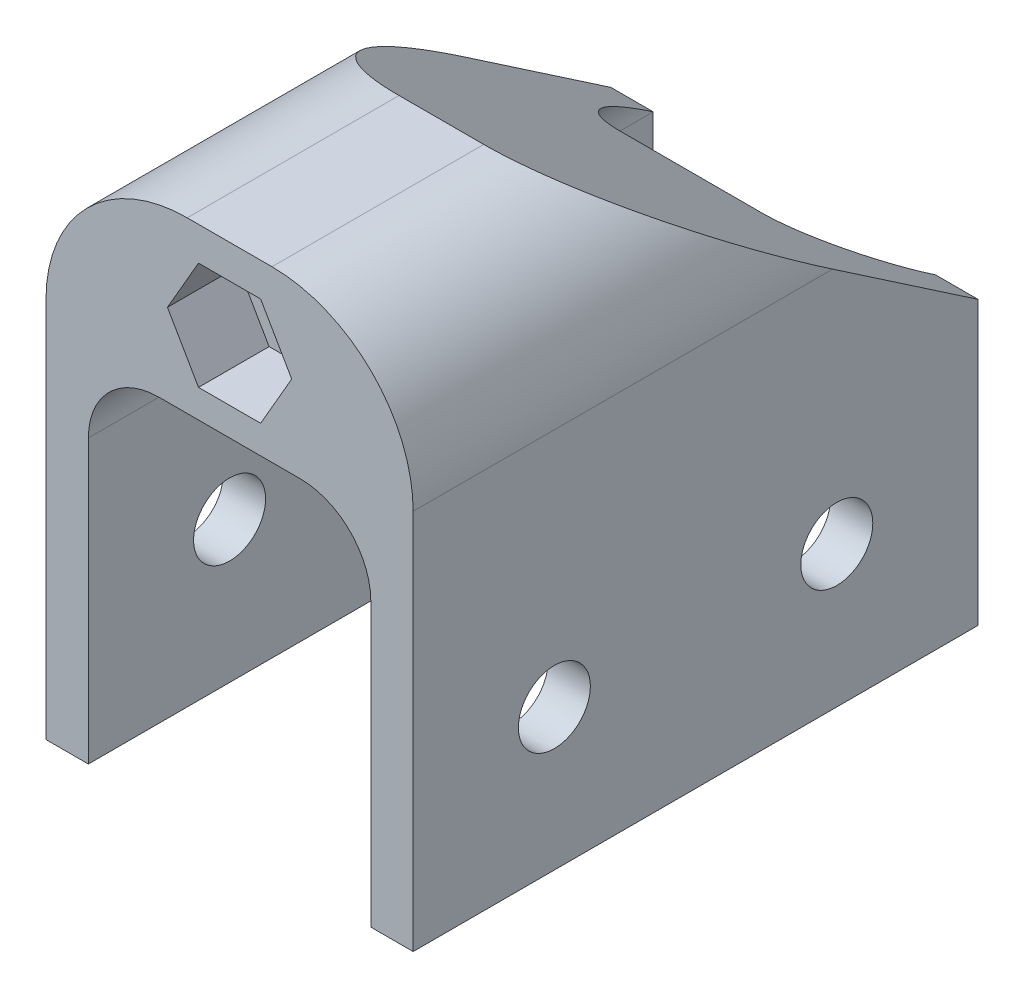
ISO-10303-21;
HEADER;
FILE_DESCRIPTION(('STEP AP214'),'2;1');
FILE_NAME('part.step','',(''),(''),'','','');
FILE_SCHEMA(('AUTOMOTIVE_DESIGN { 1 0 10303 214 1 1 1 1 }'));
ENDSEC;
DATA;
#1=APPLICATION_CONTEXT('core data for automotive mechanical design processes');
#2=APPLICATION_PROTOCOL_DEFINITION('international standard','automotive_design',2000,#1);
#3=PRODUCT_CONTEXT('',#1,'mechanical');
#4=PRODUCT('Part','Part','',(#3));
#5=PRODUCT_RELATED_PRODUCT_CATEGORY('part','',(#4));
#6=PRODUCT_DEFINITION_FORMATION('','',#4);
#7=PRODUCT_DEFINITION_CONTEXT('part definition',#1,'design');
#8=PRODUCT_DEFINITION('design','',#6,#7);
#9=PRODUCT_DEFINITION_SHAPE('','',#8);
#10=(LENGTH_UNIT() NAMED_UNIT(*) SI_UNIT(.MILLI.,.METRE.));
#11=(NAMED_UNIT(*) PLANE_ANGLE_UNIT() SI_UNIT($,.RADIAN.));
#12=(NAMED_UNIT(*) SI_UNIT($,.STERADIAN.) SOLID_ANGLE_UNIT());
#13=UNCERTAINTY_MEASURE_WITH_UNIT(LENGTH_MEASURE(1.E-05),#10,'distance_accuracy_value','');
#14=(GEOMETRIC_REPRESENTATION_CONTEXT(3) GLOBAL_UNCERTAINTY_ASSIGNED_CONTEXT((#13)) GLOBAL_UNIT_ASSIGNED_CONTEXT((#10,
#11,#12)) REPRESENTATION_CONTEXT('',''));
#15=CARTESIAN_POINT('',(0.,0.,0.));
#16=DIRECTION('',(0.,0.,1.));
#17=DIRECTION('',(1.,0.,0.));
#18=AXIS2_PLACEMENT_3D('',#15,#16,#17);
#19=CARTESIAN_POINT('',(5.,20.,0.));
#20=DIRECTION('',(0.,0.,-1.));
#21=DIRECTION('',(-1.,0.,0.));
#22=AXIS2_PLACEMENT_3D('',#19,#20,#21);
#23=PLANE('',#22);
#24=DIRECTION('',(-1.,0.,0.));
#25=VECTOR('',#24,1.);
#26=CARTESIAN_POINT('',(5.,20.,0.));
#27=LINE('',#26,#25);
#28=CARTESIAN_POINT('',(23.,20.,0.));
#29=VERTEX_POINT('',#28);
#30=CARTESIAN_POINT('',(20.,20.,0.));
#31=VERTEX_POINT('',#30);
#32=EDGE_CURVE('E11',#29,#31,#27,.T.);
#33=ORIENTED_EDGE('',*,*,#32,.F.);
#34=DIRECTION('',(0.,1.,0.));
#35=VECTOR('',#34,1.);
#36=CARTESIAN_POINT('',(23.,0.,0.));
#37=LINE('',#36,#35);
#38=CARTESIAN_POINT('',(23.,0.,0.));
#39=VERTEX_POINT('',#38);
#40=EDGE_CURVE('E160',#39,#29,#37,.T.);
#41=ORIENTED_EDGE('',*,*,#40,.F.);
#42=DIRECTION('',(1.,0.,0.));
#43=VECTOR('',#42,1.);
#44=CARTESIAN_POINT('',(20.,0.,0.));
#45=LINE('',#44,#43);
#46=CARTESIAN_POINT('',(20.,0.,0.));
#47=VERTEX_POINT('',#46);
#48=EDGE_CURVE('E158',#47,#39,#45,.T.);
#49=ORIENTED_EDGE('',*,*,#48,.F.);
#50=DIRECTION('',(0.,-1.,0.));
#51=VECTOR('',#50,1.);
#52=CARTESIAN_POINT('',(20.,20.,0.));
#53=LINE('',#52,#51);
#54=EDGE_CURVE('E156',#31,#47,#53,.T.);
#55=ORIENTED_EDGE('',*,*,#54,.F.);
#56=EDGE_LOOP('',(#33,#41,#49,#55));
#57=FACE_BOUND('',#56,.T.);
#58=ADVANCED_FACE('F34',(#57),#23,.T.);
#59=CARTESIAN_POINT('',(-3.,0.,40.));
#60=DIRECTION('',(0.,1.,0.));
#61=DIRECTION('',(0.,0.,1.));
#62=AXIS2_PLACEMENT_3D('',#59,#60,#61);
#63=PLANE('',#62);
#64=DIRECTION('',(1.,0.,0.));
#65=VECTOR('',#64,1.);
#66=CARTESIAN_POINT('',(-3.,0.,0.));
#67=LINE('',#66,#65);
#68=CARTESIAN_POINT('',(-3.,0.,0.));
#69=VERTEX_POINT('',#68);
#70=CARTESIAN_POINT('',(0.,0.,0.));
#71=VERTEX_POINT('',#70);
#72=EDGE_CURVE('E149',#69,#71,#67,.T.);
#73=ORIENTED_EDGE('',*,*,#72,.T.);
#74=DIRECTION('',(0.,0.,-1.));
#75=VECTOR('',#74,1.);
#76=CARTESIAN_POINT('',(0.,0.,40.));
#77=LINE('',#76,#75);
#78=CARTESIAN_POINT('',(0.,0.,40.));
#79=VERTEX_POINT('',#78);
#80=EDGE_CURVE('E42',#79,#71,#77,.T.);
#81=ORIENTED_EDGE('',*,*,#80,.F.);
#82=DIRECTION('',(1.,0.,0.));
#83=VECTOR('',#82,1.);
#84=CARTESIAN_POINT('',(-3.,0.,40.));
#85=LINE('',#84,#83);
#86=CARTESIAN_POINT('',(-3.,0.,40.));
#87=VERTEX_POINT('',#86);
#88=EDGE_CURVE('E164',#87,#79,#85,.T.);
#89=ORIENTED_EDGE('',*,*,#88,.F.);
#90=DIRECTION('',(0.,0.,-1.));
#91=VECTOR('',#90,1.);
#92=CARTESIAN_POINT('',(-3.,0.,40.));
#93=LINE('',#92,#91);
#94=EDGE_CURVE('E145',#87,#69,#93,.T.);
#95=ORIENTED_EDGE('',*,*,#94,.T.);
#96=EDGE_LOOP('',(#73,#81,#89,#95));
#97=FACE_BOUND('',#96,.T.);
#98=ADVANCED_FACE('F36',(#97),#63,.F.);
#99=CARTESIAN_POINT('',(0.,0.,40.));
#100=DIRECTION('',(-1.,0.,0.));
#101=DIRECTION('',(0.,0.,1.));
#102=AXIS2_PLACEMENT_3D('',#99,#100,#101);
#103=PLANE('',#102);
#104=CARTESIAN_POINT('',(0.,10.,30.));
#105=DIRECTION('',(-1.,0.,0.));
#106=DIRECTION('',(0.,0.,1.));
#107=AXIS2_PLACEMENT_3D('',#104,#105,#106);
#108=CIRCLE('',#107,2.55);
#109=CARTESIAN_POINT('',(0.,10.,32.55));
#110=VERTEX_POINT('',#109);
#111=EDGE_CURVE('E284',#110,#110,#108,.T.);
#112=ORIENTED_EDGE('',*,*,#111,.T.);
#113=EDGE_LOOP('',(#112));
#114=FACE_BOUND('',#113,.T.);
#115=CARTESIAN_POINT('',(0.,10.,10.));
#116=DIRECTION('',(-1.,0.,0.));
#117=DIRECTION('',(0.,0.,1.));
#118=AXIS2_PLACEMENT_3D('',#115,#116,#117);
#119=CIRCLE('',#118,2.55);
#120=CARTESIAN_POINT('',(0.,10.,12.55));
#121=VERTEX_POINT('',#120);
#122=EDGE_CURVE('E291',#121,#121,#119,.T.);
#123=ORIENTED_EDGE('',*,*,#122,.T.);
#124=EDGE_LOOP('',(#123));
#125=FACE_BOUND('',#124,.T.);
#126=DIRECTION('',(0.,1.,0.));
#127=VECTOR('',#126,1.);
#128=CARTESIAN_POINT('',(0.,0.,0.));
#129=LINE('',#128,#127);
#130=CARTESIAN_POINT('',(0.,20.,0.));
#131=VERTEX_POINT('',#130);
#132=EDGE_CURVE('E152',#71,#131,#129,.T.);
#133=ORIENTED_EDGE('',*,*,#132,.T.);
#134=DIRECTION('',(0.,0.,-1.));
#135=VECTOR('',#134,1.);
#136=CARTESIAN_POINT('',(0.,20.,40.));
#137=LINE('',#136,#135);
#138=CARTESIAN_POINT('',(0.,20.,40.));
#139=VERTEX_POINT('',#138);
#140=EDGE_CURVE('E186',#139,#131,#137,.T.);
#141=ORIENTED_EDGE('',*,*,#140,.F.);
#142=DIRECTION('',(0.,1.,0.));
#143=VECTOR('',#142,1.);
#144=CARTESIAN_POINT('',(0.,0.,40.));
#145=LINE('',#144,#143);
#146=EDGE_CURVE('E91',#79,#139,#145,.T.);
#147=ORIENTED_EDGE('',*,*,#146,.F.);
#148=ORIENTED_EDGE('',*,*,#80,.T.);
#149=EDGE_LOOP('',(#133,#141,#147,#148));
#150=FACE_BOUND('',#149,.T.);
#151=ADVANCED_FACE('F189',(#114,#125,#150),#103,.F.);
#152=CARTESIAN_POINT('',(5.,20.,40.));
#153=DIRECTION('',(0.,0.,-1.));
#154=DIRECTION('',(-1.,0.,0.));
#155=AXIS2_PLACEMENT_3D('',#152,#153,#154);
#156=CYLINDRICAL_SURFACE('',#155,5.);
#157=ORIENTED_EDGE('',*,*,#140,.T.);
#158=CARTESIAN_POINT('',(5.,20.,0.));
#159=DIRECTION('',(0.,-0.826926502069528,0.562310021407279));
#160=DIRECTION('',(0.,-0.562310021407279,-0.826926502069528));
#161=AXIS2_PLACEMENT_3D('',#158,#159,#160);
#162=ELLIPSE('',#161,8.89189203401822,5.);
#163=CARTESIAN_POINT('',(5.00000000000003,25.,7.3529411764706));
#164=VERTEX_POINT('',#163);
#165=EDGE_CURVE('E153',#131,#164,#162,.F.);
#166=ORIENTED_EDGE('',*,*,#165,.T.);
#167=DIRECTION('',(0.,0.,-1.));
#168=VECTOR('',#167,1.);
#169=CARTESIAN_POINT('',(5.00000000000003,25.,40.));
#170=LINE('',#169,#168);
#171=CARTESIAN_POINT('',(5.00000000000003,25.,40.));
#172=VERTEX_POINT('',#171);
#173=EDGE_CURVE('E183',#172,#164,#170,.T.);
#174=ORIENTED_EDGE('',*,*,#173,.F.);
#175=CARTESIAN_POINT('',(5.,20.,40.));
#176=DIRECTION('',(0.,0.,-1.));
#177=DIRECTION('',(-1.,0.,0.));
#178=AXIS2_PLACEMENT_3D('',#175,#176,#177);
#179=CIRCLE('',#178,5.);
#180=EDGE_CURVE('E223',#139,#172,#179,.T.);
#181=ORIENTED_EDGE('',*,*,#180,.F.);
#182=EDGE_LOOP('',(#157,#166,#174,#181));
#183=FACE_BOUND('',#182,.T.);
#184=ADVANCED_FACE('F262',(#183),#156,.F.);
#185=CARTESIAN_POINT('',(5.00000000000004,25.,40.));
#186=DIRECTION('',(0.,1.,0.));
#187=DIRECTION('',(0.,0.,1.));
#188=AXIS2_PLACEMENT_3D('',#185,#186,#187);
#189=PLANE('',#188);
#190=ORIENTED_EDGE('',*,*,#173,.T.);
#191=DIRECTION('',(1.,0.,0.));
#192=VECTOR('',#191,1.);
#193=CARTESIAN_POINT('',(5.00000000000004,25.,7.3529411764706));
#194=LINE('',#193,#192);
#195=CARTESIAN_POINT('',(15.,25.,7.3529411764706));
#196=VERTEX_POINT('',#195);
#197=EDGE_CURVE('E216',#164,#196,#194,.T.);
#198=ORIENTED_EDGE('',*,*,#197,.T.);
#199=DIRECTION('',(0.,0.,-1.));
#200=VECTOR('',#199,1.);
#201=CARTESIAN_POINT('',(15.,25.,40.));
#202=LINE('',#201,#200);
#203=CARTESIAN_POINT('',(15.,25.,40.));
#204=VERTEX_POINT('',#203);
#205=EDGE_CURVE('E180',#204,#196,#202,.T.);
#206=ORIENTED_EDGE('',*,*,#205,.F.);
#207=DIRECTION('',(1.,0.,0.));
#208=VECTOR('',#207,1.);
#209=CARTESIAN_POINT('',(5.00000000000004,25.,40.));
#210=LINE('',#209,#208);
#211=EDGE_CURVE('E225',#172,#204,#210,.T.);
#212=ORIENTED_EDGE('',*,*,#211,.F.);
#213=EDGE_LOOP('',(#190,#198,#206,#212));
#214=FACE_BOUND('',#213,.T.);
#215=ADVANCED_FACE('F265',(#214),#189,.F.);
#216=CARTESIAN_POINT('',(15.,20.,40.));
#217=DIRECTION('',(0.,0.,-1.));
#218=DIRECTION('',(-1.,0.,0.));
#219=AXIS2_PLACEMENT_3D('',#216,#217,#218);
#220=CYLINDRICAL_SURFACE('',#219,5.);
#221=ORIENTED_EDGE('',*,*,#205,.T.);
#222=CARTESIAN_POINT('',(15.,20.,0.));
#223=DIRECTION('',(0.,-0.826926502069528,0.562310021407279));
#224=DIRECTION('',(0.,-0.562310021407279,-0.826926502069528));
#225=AXIS2_PLACEMENT_3D('',#222,#223,#224);
#226=ELLIPSE('',#225,8.89189203401822,5.);
#227=EDGE_CURVE('E213',#196,#31,#226,.F.);
#228=ORIENTED_EDGE('',*,*,#227,.T.);
#229=DIRECTION('',(0.,0.,-1.));
#230=VECTOR('',#229,1.);
#231=CARTESIAN_POINT('',(20.,20.,40.));
#232=LINE('',#231,#230);
#233=CARTESIAN_POINT('',(20.,20.,40.));
#234=VERTEX_POINT('',#233);
#235=EDGE_CURVE('E177',#234,#31,#232,.T.);
#236=ORIENTED_EDGE('',*,*,#235,.F.);
#237=CARTESIAN_POINT('',(15.,20.,40.));
#238=DIRECTION('',(0.,0.,-1.));
#239=DIRECTION('',(-1.,0.,0.));
#240=AXIS2_PLACEMENT_3D('',#237,#238,#239);
#241=CIRCLE('',#240,5.);
#242=EDGE_CURVE('E227',#204,#234,#241,.T.);
#243=ORIENTED_EDGE('',*,*,#242,.F.);
#244=EDGE_LOOP('',(#221,#228,#236,#243));
#245=FACE_BOUND('',#244,.T.);
#246=ADVANCED_FACE('F271',(#245),#220,.F.);
#247=CARTESIAN_POINT('',(20.,20.,40.));
#248=DIRECTION('',(1.,0.,0.));
#249=DIRECTION('',(0.,1.,0.));
#250=AXIS2_PLACEMENT_3D('',#247,#248,#249);
#251=PLANE('',#250);
#252=CARTESIAN_POINT('',(20.,10.,30.));
#253=DIRECTION('',(1.,0.,0.));
#254=DIRECTION('',(0.,1.,0.));
#255=AXIS2_PLACEMENT_3D('',#252,#253,#254);
#256=CIRCLE('',#255,2.55);
#257=CARTESIAN_POINT('',(20.,12.55,30.));
#258=VERTEX_POINT('',#257);
#259=EDGE_CURVE('E286',#258,#258,#256,.T.);
#260=ORIENTED_EDGE('',*,*,#259,.T.);
#261=EDGE_LOOP('',(#260));
#262=FACE_BOUND('',#261,.T.);
#263=CARTESIAN_POINT('',(20.,10.,10.));
#264=DIRECTION('',(1.,0.,0.));
#265=DIRECTION('',(0.,1.,0.));
#266=AXIS2_PLACEMENT_3D('',#263,#264,#265);
#267=CIRCLE('',#266,2.55);
#268=CARTESIAN_POINT('',(20.,12.55,10.));
#269=VERTEX_POINT('',#268);
#270=EDGE_CURVE('E296',#269,#269,#267,.T.);
#271=ORIENTED_EDGE('',*,*,#270,.T.);
#272=EDGE_LOOP('',(#271));
#273=FACE_BOUND('',#272,.T.);
#274=ORIENTED_EDGE('',*,*,#54,.T.);
#275=DIRECTION('',(0.,0.,-1.));
#276=VECTOR('',#275,1.);
#277=CARTESIAN_POINT('',(20.,0.,40.));
#278=LINE('',#277,#276);
#279=CARTESIAN_POINT('',(20.,0.,40.));
#280=VERTEX_POINT('',#279);
#281=EDGE_CURVE('E174',#280,#47,#278,.T.);
#282=ORIENTED_EDGE('',*,*,#281,.F.);
#283=DIRECTION('',(0.,-1.,0.));
#284=VECTOR('',#283,1.);
#285=CARTESIAN_POINT('',(20.,20.,40.));
#286=LINE('',#285,#284);
#287=EDGE_CURVE('E229',#234,#280,#286,.T.);
#288=ORIENTED_EDGE('',*,*,#287,.F.);
#289=ORIENTED_EDGE('',*,*,#235,.T.);
#290=EDGE_LOOP('',(#274,#282,#288,#289));
#291=FACE_BOUND('',#290,.T.);
#292=ADVANCED_FACE('F274',(#262,#273,#291),#251,.F.);
#293=CARTESIAN_POINT('',(20.,0.,40.));
#294=DIRECTION('',(0.,1.,0.));
#295=DIRECTION('',(-1.,0.,0.));
#296=AXIS2_PLACEMENT_3D('',#293,#294,#295);
#297=PLANE('',#296);
#298=ORIENTED_EDGE('',*,*,#48,.T.);
#299=DIRECTION('',(0.,0.,-1.));
#300=VECTOR('',#299,1.);
#301=CARTESIAN_POINT('',(23.,0.,40.));
#302=LINE('',#301,#300);
#303=CARTESIAN_POINT('',(23.,0.,40.));
#304=VERTEX_POINT('',#303);
#305=EDGE_CURVE('E171',#304,#39,#302,.T.);
#306=ORIENTED_EDGE('',*,*,#305,.F.);
#307=DIRECTION('',(1.,0.,0.));
#308=VECTOR('',#307,1.);
#309=CARTESIAN_POINT('',(20.,0.,40.));
#310=LINE('',#309,#308);
#311=EDGE_CURVE('E231',#280,#304,#310,.T.);
#312=ORIENTED_EDGE('',*,*,#311,.F.);
#313=ORIENTED_EDGE('',*,*,#281,.T.);
#314=EDGE_LOOP('',(#298,#306,#312,#313));
#315=FACE_BOUND('',#314,.T.);
#316=ADVANCED_FACE('F277',(#315),#297,.F.);
#317=CARTESIAN_POINT('',(23.,0.,40.));
#318=DIRECTION('',(-1.,0.,0.));
#319=DIRECTION('',(0.,0.,1.));
#320=AXIS2_PLACEMENT_3D('',#317,#318,#319);
#321=PLANE('',#320);
#322=CARTESIAN_POINT('',(23.,10.,30.));
#323=DIRECTION('',(1.,0.,0.));
#324=DIRECTION('',(0.,0.,-1.));
#325=AXIS2_PLACEMENT_3D('',#322,#323,#324);
#326=CIRCLE('',#325,2.55);
#327=CARTESIAN_POINT('',(23.,10.,27.45));
#328=VERTEX_POINT('',#327);
#329=EDGE_CURVE('E307',#328,#328,#326,.T.);
#330=ORIENTED_EDGE('',*,*,#329,.F.);
#331=EDGE_LOOP('',(#330));
#332=FACE_BOUND('',#331,.T.);
#333=CARTESIAN_POINT('',(23.,10.,10.));
#334=DIRECTION('',(1.,0.,0.));
#335=DIRECTION('',(0.,0.,-1.));
#336=AXIS2_PLACEMENT_3D('',#333,#334,#335);
#337=CIRCLE('',#336,2.55);
#338=CARTESIAN_POINT('',(23.,10.,7.45));
#339=VERTEX_POINT('',#338);
#340=EDGE_CURVE('E300',#339,#339,#337,.T.);
#341=ORIENTED_EDGE('',*,*,#340,.F.);
#342=EDGE_LOOP('',(#341));
#343=FACE_BOUND('',#342,.T.);
#344=ORIENTED_EDGE('',*,*,#40,.T.);
#345=DIRECTION('',(0.,-0.562310021407279,-0.826926502069528));
#346=VECTOR('',#345,1.);
#347=CARTESIAN_POINT('',(23.,20.,0.));
#348=LINE('',#347,#346);
#349=CARTESIAN_POINT('',(23.,27.,10.2941176470588));
#350=VERTEX_POINT('',#349);
#351=EDGE_CURVE('E208',#350,#29,#348,.T.);
#352=ORIENTED_EDGE('',*,*,#351,.F.);
#353=DIRECTION('',(0.,0.,-1.));
#354=VECTOR('',#353,1.);
#355=CARTESIAN_POINT('',(23.,26.9999999999999,40.));
#356=LINE('',#355,#354);
#357=CARTESIAN_POINT('',(23.,26.9999999999999,40.));
#358=VERTEX_POINT('',#357);
#359=EDGE_CURVE('E168',#358,#350,#356,.T.);
#360=ORIENTED_EDGE('',*,*,#359,.F.);
#361=DIRECTION('',(0.,1.,0.));
#362=VECTOR('',#361,1.);
#363=CARTESIAN_POINT('',(23.,0.,40.));
#364=LINE('',#363,#362);
#365=EDGE_CURVE('E233',#304,#358,#364,.T.);
#366=ORIENTED_EDGE('',*,*,#365,.F.);
#367=ORIENTED_EDGE('',*,*,#305,.T.);
#368=EDGE_LOOP('',(#344,#352,#360,#366,#367));
#369=FACE_BOUND('',#368,.T.);
#370=ADVANCED_FACE('F240',(#332,#343,#369),#321,.F.);
#371=CARTESIAN_POINT('',(13.,27.,40.));
#372=DIRECTION('',(0.,0.,-1.));
#373=DIRECTION('',(-1.,0.,0.));
#374=AXIS2_PLACEMENT_3D('',#371,#372,#373);
#375=CYLINDRICAL_SURFACE('',#374,10.);
#376=ORIENTED_EDGE('',*,*,#359,.T.);
#377=CARTESIAN_POINT('',(13.,27.,10.2941176470588));
#378=DIRECTION('',(0.,-0.826926502069528,0.562310021407279));
#379=DIRECTION('',(0.,-0.562310021407279,-0.826926502069528));
#380=AXIS2_PLACEMENT_3D('',#377,#378,#379);
#381=ELLIPSE('',#380,17.7837840680364,10.);
#382=CARTESIAN_POINT('',(12.9999999999999,37.,25.));
#383=VERTEX_POINT('',#382);
#384=EDGE_CURVE('E203',#350,#383,#381,.T.);
#385=ORIENTED_EDGE('',*,*,#384,.T.);
#386=DIRECTION('',(0.,0.,-1.));
#387=VECTOR('',#386,1.);
#388=CARTESIAN_POINT('',(12.9999999999999,37.,40.));
#389=LINE('',#388,#387);
#390=CARTESIAN_POINT('',(12.9999999999999,37.,40.));
#391=VERTEX_POINT('',#390);
#392=EDGE_CURVE('E139',#391,#383,#389,.T.);
#393=ORIENTED_EDGE('',*,*,#392,.F.);
#394=CARTESIAN_POINT('',(13.,27.,40.));
#395=DIRECTION('',(0.,0.,1.));
#396=DIRECTION('',(1.,0.,0.));
#397=AXIS2_PLACEMENT_3D('',#394,#395,#396);
#398=CIRCLE('',#397,10.);
#399=EDGE_CURVE('E125',#358,#391,#398,.T.);
#400=ORIENTED_EDGE('',*,*,#399,.F.);
#401=EDGE_LOOP('',(#376,#385,#393,#400));
#402=FACE_BOUND('',#401,.T.);
#403=ADVANCED_FACE('F244',(#402),#375,.T.);
#404=CARTESIAN_POINT('',(7.00000000000007,37.,40.));
#405=DIRECTION('',(0.,-1.,0.));
#406=DIRECTION('',(0.,0.,-1.));
#407=AXIS2_PLACEMENT_3D('',#404,#405,#406);
#408=PLANE('',#407);
#409=ORIENTED_EDGE('',*,*,#392,.T.);
#410=DIRECTION('',(1.,0.,0.));
#411=VECTOR('',#410,1.);
#412=CARTESIAN_POINT('',(-3.,37.,25.));
#413=LINE('',#412,#411);
#414=CARTESIAN_POINT('',(7.,37.,25.));
#415=VERTEX_POINT('',#414);
#416=EDGE_CURVE('E136',#415,#383,#413,.T.);
#417=ORIENTED_EDGE('',*,*,#416,.F.);
#418=DIRECTION('',(0.,0.,-1.));
#419=VECTOR('',#418,1.);
#420=CARTESIAN_POINT('',(7.00000000000007,37.,40.));
#421=LINE('',#420,#419);
#422=CARTESIAN_POINT('',(7.00000000000007,37.,40.));
#423=VERTEX_POINT('',#422);
#424=EDGE_CURVE('E132',#423,#415,#421,.T.);
#425=ORIENTED_EDGE('',*,*,#424,.F.);
#426=DIRECTION('',(-1.,0.,0.));
#427=VECTOR('',#426,1.);
#428=CARTESIAN_POINT('',(7.00000000000007,37.,40.));
#429=LINE('',#428,#427);
#430=EDGE_CURVE('E118',#391,#423,#429,.T.);
#431=ORIENTED_EDGE('',*,*,#430,.F.);
#432=EDGE_LOOP('',(#409,#417,#425,#431));
#433=FACE_BOUND('',#432,.T.);
#434=ADVANCED_FACE('F133',(#433),#408,.F.);
#435=CARTESIAN_POINT('',(7.,27.,40.));
#436=DIRECTION('',(0.,0.,-1.));
#437=DIRECTION('',(-1.,0.,0.));
#438=AXIS2_PLACEMENT_3D('',#435,#436,#437);
#439=CYLINDRICAL_SURFACE('',#438,10.);
#440=ORIENTED_EDGE('',*,*,#424,.T.);
#441=CARTESIAN_POINT('',(7.,27.,10.2941176470588));
#442=DIRECTION('',(0.,-0.826926502069528,0.562310021407279));
#443=DIRECTION('',(0.,-0.562310021407279,-0.826926502069528));
#444=AXIS2_PLACEMENT_3D('',#441,#442,#443);
#445=ELLIPSE('',#444,17.7837840680364,10.);
#446=CARTESIAN_POINT('',(-3.,26.9999999999999,10.2941176470587));
#447=VERTEX_POINT('',#446);
#448=EDGE_CURVE('E201',#415,#447,#445,.T.);
#449=ORIENTED_EDGE('',*,*,#448,.T.);
#450=DIRECTION('',(0.,0.,-1.));
#451=VECTOR('',#450,1.);
#452=CARTESIAN_POINT('',(-3.,26.9999999999999,40.));
#453=LINE('',#452,#451);
#454=CARTESIAN_POINT('',(-3.,26.9999999999999,40.));
#455=VERTEX_POINT('',#454);
#456=EDGE_CURVE('E140',#455,#447,#453,.T.);
#457=ORIENTED_EDGE('',*,*,#456,.F.);
#458=CARTESIAN_POINT('',(7.,27.,40.));
#459=DIRECTION('',(0.,0.,1.));
#460=DIRECTION('',(1.,0.,0.));
#461=AXIS2_PLACEMENT_3D('',#458,#459,#460);
#462=CIRCLE('',#461,10.);
#463=EDGE_CURVE('E122',#423,#455,#462,.T.);
#464=ORIENTED_EDGE('',*,*,#463,.F.);
#465=EDGE_LOOP('',(#440,#449,#457,#464));
#466=FACE_BOUND('',#465,.T.);
#467=ADVANCED_FACE('F142',(#466),#439,.T.);
#468=CARTESIAN_POINT('',(-3.,26.9999999999999,40.));
#469=DIRECTION('',(1.,0.,0.));
#470=DIRECTION('',(0.,1.,0.));
#471=AXIS2_PLACEMENT_3D('',#468,#469,#470);
#472=PLANE('',#471);
#473=CARTESIAN_POINT('',(-3.,10.,30.));
#474=DIRECTION('',(1.,0.,0.));
#475=DIRECTION('',(0.,0.,-1.));
#476=AXIS2_PLACEMENT_3D('',#473,#474,#475);
#477=CIRCLE('',#476,2.55);
#478=CARTESIAN_POINT('',(-3.,10.,27.45));
#479=VERTEX_POINT('',#478);
#480=EDGE_CURVE('E299',#479,#479,#477,.T.);
#481=ORIENTED_EDGE('',*,*,#480,.T.);
#482=EDGE_LOOP('',(#481));
#483=FACE_BOUND('',#482,.T.);
#484=CARTESIAN_POINT('',(-3.,10.,10.));
#485=DIRECTION('',(1.,0.,0.));
#486=DIRECTION('',(0.,0.,-1.));
#487=AXIS2_PLACEMENT_3D('',#484,#485,#486);
#488=CIRCLE('',#487,2.55);
#489=CARTESIAN_POINT('',(-3.,10.,7.45));
#490=VERTEX_POINT('',#489);
#491=EDGE_CURVE('E303',#490,#490,#488,.T.);
#492=ORIENTED_EDGE('',*,*,#491,.T.);
#493=EDGE_LOOP('',(#492));
#494=FACE_BOUND('',#493,.T.);
#495=ORIENTED_EDGE('',*,*,#456,.T.);
#496=DIRECTION('',(0.,-0.562310021407279,-0.826926502069528));
#497=VECTOR('',#496,1.);
#498=CARTESIAN_POINT('',(-3.,20.,0.));
#499=LINE('',#498,#497);
#500=CARTESIAN_POINT('',(-3.,20.,0.));
#501=VERTEX_POINT('',#500);
#502=EDGE_CURVE('E205',#447,#501,#499,.T.);
#503=ORIENTED_EDGE('',*,*,#502,.T.);
#504=DIRECTION('',(0.,-1.,0.));
#505=VECTOR('',#504,1.);
#506=CARTESIAN_POINT('',(-3.,26.9999999999999,0.));
#507=LINE('',#506,#505);
#508=EDGE_CURVE('E82',#501,#69,#507,.T.);
#509=ORIENTED_EDGE('',*,*,#508,.T.);
#510=ORIENTED_EDGE('',*,*,#94,.F.);
#511=DIRECTION('',(0.,-1.,0.));
#512=VECTOR('',#511,1.);
#513=CARTESIAN_POINT('',(-3.,26.9999999999999,40.));
#514=LINE('',#513,#512);
#515=EDGE_CURVE('E58',#455,#87,#514,.T.);
#516=ORIENTED_EDGE('',*,*,#515,.F.);
#517=EDGE_LOOP('',(#495,#503,#509,#510,#516));
#518=FACE_BOUND('',#517,.T.);
#519=ADVANCED_FACE('F408',(#483,#494,#518),#472,.F.);
#520=CARTESIAN_POINT('',(5.,20.,40.));
#521=DIRECTION('',(0.,0.,-1.));
#522=DIRECTION('',(-1.,0.,0.));
#523=AXIS2_PLACEMENT_3D('',#520,#521,#522);
#524=PLANE('',#523);
#525=DIRECTION('',(0.5,-0.866025403784439,0.));
#526=VECTOR('',#525,1.);
#527=CARTESIAN_POINT('',(5.59999999999996,30.8105117766516,40.));
#528=LINE('',#527,#526);
#529=CARTESIAN_POINT('',(5.59999999999996,30.8105117766516,40.));
#530=VERTEX_POINT('',#529);
#531=CARTESIAN_POINT('',(7.79999999999998,27.,40.));
#532=VERTEX_POINT('',#531);
#533=EDGE_CURVE('E341',#530,#532,#528,.T.);
#534=ORIENTED_EDGE('',*,*,#533,.F.);
#535=DIRECTION('',(-0.499999999999999,-0.866025403784439,0.));
#536=VECTOR('',#535,1.);
#537=CARTESIAN_POINT('',(7.79999999999998,34.6210235533031,40.));
#538=LINE('',#537,#536);
#539=CARTESIAN_POINT('',(7.79999999999998,34.6210235533031,40.));
#540=VERTEX_POINT('',#539);
#541=EDGE_CURVE('E49',#540,#530,#538,.T.);
#542=ORIENTED_EDGE('',*,*,#541,.F.);
#543=DIRECTION('',(-1.,0.,0.));
#544=VECTOR('',#543,1.);
#545=CARTESIAN_POINT('',(12.2,34.6210235533031,40.));
#546=LINE('',#545,#544);
#547=CARTESIAN_POINT('',(12.2,34.6210235533031,40.));
#548=VERTEX_POINT('',#547);
#549=EDGE_CURVE('E328',#548,#540,#546,.T.);
#550=ORIENTED_EDGE('',*,*,#549,.F.);
#551=DIRECTION('',(-0.5,0.866025403784438,0.));
#552=VECTOR('',#551,1.);
#553=CARTESIAN_POINT('',(14.4,30.8105117766516,40.));
#554=LINE('',#553,#552);
#555=CARTESIAN_POINT('',(14.4,30.8105117766516,40.));
#556=VERTEX_POINT('',#555);
#557=EDGE_CURVE('E332',#556,#548,#554,.T.);
#558=ORIENTED_EDGE('',*,*,#557,.F.);
#559=DIRECTION('',(0.5,0.866025403784439,0.));
#560=VECTOR('',#559,1.);
#561=CARTESIAN_POINT('',(12.2,27.,40.));
#562=LINE('',#561,#560);
#563=CARTESIAN_POINT('',(12.2,27.,40.));
#564=VERTEX_POINT('',#563);
#565=EDGE_CURVE('E335',#564,#556,#562,.T.);
#566=ORIENTED_EDGE('',*,*,#565,.F.);
#567=DIRECTION('',(1.,0.,0.));
#568=VECTOR('',#567,1.);
#569=CARTESIAN_POINT('',(7.79999999999998,27.,40.));
#570=LINE('',#569,#568);
#571=EDGE_CURVE('E338',#532,#564,#570,.T.);
#572=ORIENTED_EDGE('',*,*,#571,.F.);
#573=EDGE_LOOP('',(#534,#542,#550,#558,#566,#572));
#574=FACE_BOUND('',#573,.T.);
#575=ORIENTED_EDGE('',*,*,#88,.T.);
#576=ORIENTED_EDGE('',*,*,#146,.T.);
#577=ORIENTED_EDGE('',*,*,#180,.T.);
#578=ORIENTED_EDGE('',*,*,#211,.T.);
#579=ORIENTED_EDGE('',*,*,#242,.T.);
#580=ORIENTED_EDGE('',*,*,#287,.T.);
#581=ORIENTED_EDGE('',*,*,#311,.T.);
#582=ORIENTED_EDGE('',*,*,#365,.T.);
#583=ORIENTED_EDGE('',*,*,#399,.T.);
#584=ORIENTED_EDGE('',*,*,#430,.T.);
#585=ORIENTED_EDGE('',*,*,#463,.T.);
#586=ORIENTED_EDGE('',*,*,#515,.T.);
#587=EDGE_LOOP('',(#575,#576,#577,#578,#579,#580,#581,#582,#583,#584,#585,#586));
#588=FACE_BOUND('',#587,.T.);
#589=ADVANCED_FACE('F120',(#574,#588),#524,.F.);
#590=DIRECTION('',(1.,0.,0.));
#591=VECTOR('',#590,1.);
#592=CARTESIAN_POINT('',(-3.,20.,0.));
#593=LINE('',#592,#591);
#594=EDGE_CURVE('E198',#501,#131,#593,.T.);
#595=ORIENTED_EDGE('',*,*,#594,.T.);
#596=ORIENTED_EDGE('',*,*,#132,.F.);
#597=ORIENTED_EDGE('',*,*,#72,.F.);
#598=ORIENTED_EDGE('',*,*,#508,.F.);
#599=EDGE_LOOP('',(#595,#596,#597,#598));
#600=FACE_BOUND('',#599,.T.);
#601=ADVANCED_FACE('F195',(#600),#23,.T.);
#602=CARTESIAN_POINT('',(-3.,20.,0.));
#603=DIRECTION('',(0.,-0.826926502069528,0.562310021407279));
#604=DIRECTION('',(0.,-0.562310021407279,-0.826926502069528));
#605=AXIS2_PLACEMENT_3D('',#602,#603,#604);
#606=PLANE('',#605);
#607=ORIENTED_EDGE('',*,*,#594,.F.);
#608=ORIENTED_EDGE('',*,*,#502,.F.);
#609=ORIENTED_EDGE('',*,*,#448,.F.);
#610=ORIENTED_EDGE('',*,*,#416,.T.);
#611=ORIENTED_EDGE('',*,*,#384,.F.);
#612=ORIENTED_EDGE('',*,*,#351,.T.);
#613=ORIENTED_EDGE('',*,*,#32,.T.);
#614=ORIENTED_EDGE('',*,*,#227,.F.);
#615=ORIENTED_EDGE('',*,*,#197,.F.);
#616=ORIENTED_EDGE('',*,*,#165,.F.);
#617=EDGE_LOOP('',(#607,#608,#609,#610,#611,#612,#613,#614,#615,#616));
#618=FACE_BOUND('',#617,.T.);
#619=ADVANCED_FACE('F257',(#618),#606,.F.);
#620=CARTESIAN_POINT('',(-3.,10.,10.));
#621=DIRECTION('',(1.,0.,0.));
#622=DIRECTION('',(0.,0.,-1.));
#623=AXIS2_PLACEMENT_3D('',#620,#621,#622);
#624=CYLINDRICAL_SURFACE('',#623,2.55);
#625=ORIENTED_EDGE('',*,*,#491,.F.);
#626=EDGE_LOOP('',(#625));
#627=FACE_BOUND('',#626,.T.);
#628=ORIENTED_EDGE('',*,*,#122,.F.);
#629=EDGE_LOOP('',(#628));
#630=FACE_BOUND('',#629,.T.);
#631=ADVANCED_FACE('F429',(#627,#630),#624,.F.);
#632=CARTESIAN_POINT('',(-3.,10.,30.));
#633=DIRECTION('',(1.,0.,0.));
#634=DIRECTION('',(0.,0.,-1.));
#635=AXIS2_PLACEMENT_3D('',#632,#633,#634);
#636=CYLINDRICAL_SURFACE('',#635,2.55);
#637=ORIENTED_EDGE('',*,*,#480,.F.);
#638=EDGE_LOOP('',(#637));
#639=FACE_BOUND('',#638,.T.);
#640=ORIENTED_EDGE('',*,*,#111,.F.);
#641=EDGE_LOOP('',(#640));
#642=FACE_BOUND('',#641,.T.);
#643=ADVANCED_FACE('F434',(#639,#642),#636,.F.);
#644=ORIENTED_EDGE('',*,*,#340,.T.);
#645=EDGE_LOOP('',(#644));
#646=FACE_BOUND('',#645,.T.);
#647=ORIENTED_EDGE('',*,*,#270,.F.);
#648=EDGE_LOOP('',(#647));
#649=FACE_BOUND('',#648,.T.);
#650=ADVANCED_FACE('F437',(#646,#649),#624,.F.);
#651=ORIENTED_EDGE('',*,*,#329,.T.);
#652=EDGE_LOOP('',(#651));
#653=FACE_BOUND('',#652,.T.);
#654=ORIENTED_EDGE('',*,*,#259,.F.);
#655=EDGE_LOOP('',(#654));
#656=FACE_BOUND('',#655,.T.);
#657=ADVANCED_FACE('F442',(#653,#656),#636,.F.);
#658=CARTESIAN_POINT('',(7.79999999999998,34.6210235533031,35.));
#659=DIRECTION('',(-0.866025403784439,0.499999999999999,0.));
#660=DIRECTION('',(-0.499999999999999,-0.866025403784439,0.));
#661=AXIS2_PLACEMENT_3D('',#658,#659,#660);
#662=PLANE('',#661);
#663=ORIENTED_EDGE('',*,*,#541,.T.);
#664=DIRECTION('',(0.,0.,1.));
#665=VECTOR('',#664,1.);
#666=CARTESIAN_POINT('',(5.59999999999996,30.8105117766516,35.));
#667=LINE('',#666,#665);
#668=CARTESIAN_POINT('',(5.59999999999996,30.8105117766516,35.));
#669=VERTEX_POINT('',#668);
#670=EDGE_CURVE('E312',#669,#530,#667,.T.);
#671=ORIENTED_EDGE('',*,*,#670,.F.);
#672=DIRECTION('',(-0.499999999999999,-0.866025403784439,0.));
#673=VECTOR('',#672,1.);
#674=CARTESIAN_POINT('',(7.79999999999998,34.6210235533031,35.));
#675=LINE('',#674,#673);
#676=CARTESIAN_POINT('',(7.79999999999998,34.6210235533031,35.));
#677=VERTEX_POINT('',#676);
#678=EDGE_CURVE('E331',#677,#669,#675,.T.);
#679=ORIENTED_EDGE('',*,*,#678,.F.);
#680=DIRECTION('',(0.,0.,1.));
#681=VECTOR('',#680,1.);
#682=CARTESIAN_POINT('',(7.79999999999998,34.6210235533031,35.));
#683=LINE('',#682,#681);
#684=EDGE_CURVE('E304',#677,#540,#683,.T.);
#685=ORIENTED_EDGE('',*,*,#684,.T.);
#686=EDGE_LOOP('',(#663,#671,#679,#685));
#687=FACE_BOUND('',#686,.T.);
#688=ADVANCED_FACE('F388',(#687),#662,.F.);
#689=CARTESIAN_POINT('',(12.2,34.6210235533031,35.));
#690=DIRECTION('',(0.,1.,0.));
#691=DIRECTION('',(0.,0.,1.));
#692=AXIS2_PLACEMENT_3D('',#689,#690,#691);
#693=PLANE('',#692);
#694=ORIENTED_EDGE('',*,*,#549,.T.);
#695=ORIENTED_EDGE('',*,*,#684,.F.);
#696=DIRECTION('',(-1.,0.,0.));
#697=VECTOR('',#696,1.);
#698=CARTESIAN_POINT('',(12.2,34.6210235533031,35.));
#699=LINE('',#698,#697);
#700=CARTESIAN_POINT('',(12.2,34.6210235533031,35.));
#701=VERTEX_POINT('',#700);
#702=EDGE_CURVE('E315',#701,#677,#699,.T.);
#703=ORIENTED_EDGE('',*,*,#702,.F.);
#704=DIRECTION('',(0.,0.,1.));
#705=VECTOR('',#704,1.);
#706=CARTESIAN_POINT('',(12.2,34.6210235533031,35.));
#707=LINE('',#706,#705);
#708=EDGE_CURVE('E324',#701,#548,#707,.T.);
#709=ORIENTED_EDGE('',*,*,#708,.T.);
#710=EDGE_LOOP('',(#694,#695,#703,#709));
#711=FACE_BOUND('',#710,.T.);
#712=ADVANCED_FACE('F445',(#711),#693,.F.);
#713=CARTESIAN_POINT('',(14.4,30.8105117766516,35.));
#714=DIRECTION('',(0.866025403784438,0.5,0.));
#715=DIRECTION('',(-0.5,0.866025403784439,0.));
#716=AXIS2_PLACEMENT_3D('',#713,#714,#715);
#717=PLANE('',#716);
#718=ORIENTED_EDGE('',*,*,#557,.T.);
#719=ORIENTED_EDGE('',*,*,#708,.F.);
#720=DIRECTION('',(-0.5,0.866025403784438,0.));
#721=VECTOR('',#720,1.);
#722=CARTESIAN_POINT('',(14.4,30.8105117766516,35.));
#723=LINE('',#722,#721);
#724=CARTESIAN_POINT('',(14.4,30.8105117766516,35.));
#725=VERTEX_POINT('',#724);
#726=EDGE_CURVE('E348',#725,#701,#723,.T.);
#727=ORIENTED_EDGE('',*,*,#726,.F.);
#728=DIRECTION('',(0.,0.,1.));
#729=VECTOR('',#728,1.);
#730=CARTESIAN_POINT('',(14.4,30.8105117766516,35.));
#731=LINE('',#730,#729);
#732=EDGE_CURVE('E321',#725,#556,#731,.T.);
#733=ORIENTED_EDGE('',*,*,#732,.T.);
#734=EDGE_LOOP('',(#718,#719,#727,#733));
#735=FACE_BOUND('',#734,.T.);
#736=ADVANCED_FACE('F456',(#735),#717,.F.);
#737=CARTESIAN_POINT('',(12.2,27.,35.));
#738=DIRECTION('',(0.866025403784439,-0.5,0.));
#739=DIRECTION('',(0.5,0.866025403784439,0.));
#740=AXIS2_PLACEMENT_3D('',#737,#738,#739);
#741=PLANE('',#740);
#742=ORIENTED_EDGE('',*,*,#565,.T.);
#743=ORIENTED_EDGE('',*,*,#732,.F.);
#744=DIRECTION('',(0.5,0.866025403784439,0.));
#745=VECTOR('',#744,1.);
#746=CARTESIAN_POINT('',(12.2,27.,35.));
#747=LINE('',#746,#745);
#748=CARTESIAN_POINT('',(12.2,27.,35.));
#749=VERTEX_POINT('',#748);
#750=EDGE_CURVE('E351',#749,#725,#747,.T.);
#751=ORIENTED_EDGE('',*,*,#750,.F.);
#752=DIRECTION('',(0.,0.,1.));
#753=VECTOR('',#752,1.);
#754=CARTESIAN_POINT('',(12.2,27.,35.));
#755=LINE('',#754,#753);
#756=EDGE_CURVE('E318',#749,#564,#755,.T.);
#757=ORIENTED_EDGE('',*,*,#756,.T.);
#758=EDGE_LOOP('',(#742,#743,#751,#757));
#759=FACE_BOUND('',#758,.T.);
#760=ADVANCED_FACE('F452',(#759),#741,.F.);
#761=CARTESIAN_POINT('',(7.79999999999998,27.,35.));
#762=DIRECTION('',(0.,-1.,0.));
#763=DIRECTION('',(0.,0.,-1.));
#764=AXIS2_PLACEMENT_3D('',#761,#762,#763);
#765=PLANE('',#764);
#766=ORIENTED_EDGE('',*,*,#571,.T.);
#767=ORIENTED_EDGE('',*,*,#756,.F.);
#768=DIRECTION('',(1.,0.,0.));
#769=VECTOR('',#768,1.);
#770=CARTESIAN_POINT('',(7.79999999999998,27.,35.));
#771=LINE('',#770,#769);
#772=CARTESIAN_POINT('',(7.79999999999998,27.,35.));
#773=VERTEX_POINT('',#772);
#774=EDGE_CURVE('E354',#773,#749,#771,.T.);
#775=ORIENTED_EDGE('',*,*,#774,.F.);
#776=DIRECTION('',(0.,0.,1.));
#777=VECTOR('',#776,1.);
#778=CARTESIAN_POINT('',(7.79999999999998,27.,35.));
#779=LINE('',#778,#777);
#780=EDGE_CURVE('E314',#773,#532,#779,.T.);
#781=ORIENTED_EDGE('',*,*,#780,.T.);
#782=EDGE_LOOP('',(#766,#767,#775,#781));
#783=FACE_BOUND('',#782,.T.);
#784=ADVANCED_FACE('F448',(#783),#765,.F.);
#785=CARTESIAN_POINT('',(5.59999999999996,30.8105117766516,35.));
#786=DIRECTION('',(-0.866025403784438,-0.5,0.));
#787=DIRECTION('',(0.5,-0.866025403784438,0.));
#788=AXIS2_PLACEMENT_3D('',#785,#786,#787);
#789=PLANE('',#788);
#790=ORIENTED_EDGE('',*,*,#533,.T.);
#791=ORIENTED_EDGE('',*,*,#780,.F.);
#792=DIRECTION('',(0.5,-0.866025403784439,0.));
#793=VECTOR('',#792,1.);
#794=CARTESIAN_POINT('',(5.59999999999996,30.8105117766516,35.));
#795=LINE('',#794,#793);
#796=EDGE_CURVE('E357',#669,#773,#795,.T.);
#797=ORIENTED_EDGE('',*,*,#796,.F.);
#798=ORIENTED_EDGE('',*,*,#670,.T.);
#799=EDGE_LOOP('',(#790,#791,#797,#798));
#800=FACE_BOUND('',#799,.T.);
#801=ADVANCED_FACE('F379',(#800),#789,.F.);
#802=CARTESIAN_POINT('',(0.,0.,35.));
#803=DIRECTION('',(0.,0.,1.));
#804=DIRECTION('',(1.,0.,0.));
#805=AXIS2_PLACEMENT_3D('',#802,#803,#804);
#806=PLANE('',#805);
#807=CARTESIAN_POINT('',(10.,30.8105117766516,35.));
#808=DIRECTION('',(0.,0.,1.));
#809=DIRECTION('',(1.,0.,0.));
#810=AXIS2_PLACEMENT_3D('',#807,#808,#809);
#811=CIRCLE('',#810,2.55);
#812=CARTESIAN_POINT('',(12.55,30.8105117766516,35.));
#813=VERTEX_POINT('',#812);
#814=EDGE_CURVE('E362',#813,#813,#811,.T.);
#815=ORIENTED_EDGE('',*,*,#814,.F.);
#816=EDGE_LOOP('',(#815));
#817=FACE_BOUND('',#816,.T.);
#818=ORIENTED_EDGE('',*,*,#678,.T.);
#819=ORIENTED_EDGE('',*,*,#796,.T.);
#820=ORIENTED_EDGE('',*,*,#774,.T.);
#821=ORIENTED_EDGE('',*,*,#750,.T.);
#822=ORIENTED_EDGE('',*,*,#726,.T.);
#823=ORIENTED_EDGE('',*,*,#702,.T.);
#824=EDGE_LOOP('',(#818,#819,#820,#821,#822,#823));
#825=FACE_BOUND('',#824,.T.);
#826=ADVANCED_FACE('F373',(#817,#825),#806,.T.);
#827=CARTESIAN_POINT('',(10.,30.8105117766516,34.));
#828=DIRECTION('',(0.,0.,1.));
#829=DIRECTION('',(1.,0.,0.));
#830=AXIS2_PLACEMENT_3D('',#827,#828,#829);
#831=CYLINDRICAL_SURFACE('',#830,2.55);
#832=CARTESIAN_POINT('',(10.,30.8105117766516,34.));
#833=DIRECTION('',(0.,0.,1.));
#834=DIRECTION('',(1.,0.,0.));
#835=AXIS2_PLACEMENT_3D('',#832,#833,#834);
#836=CIRCLE('',#835,2.55);
#837=CARTESIAN_POINT('',(12.55,30.8105117766516,34.));
#838=VERTEX_POINT('',#837);
#839=EDGE_CURVE('E345',#838,#838,#836,.T.);
#840=ORIENTED_EDGE('',*,*,#839,.F.);
#841=EDGE_LOOP('',(#840));
#842=FACE_BOUND('',#841,.T.);
#843=ORIENTED_EDGE('',*,*,#814,.T.);
#844=EDGE_LOOP('',(#843));
#845=FACE_BOUND('',#844,.T.);
#846=ADVANCED_FACE('F370',(#842,#845),#831,.F.);
#847=CARTESIAN_POINT('',(10.,30.8105117766516,34.));
#848=DIRECTION('',(0.,0.,1.));
#849=DIRECTION('',(1.,0.,0.));
#850=AXIS2_PLACEMENT_3D('',#847,#848,#849);
#851=PLANE('',#850);
#852=ORIENTED_EDGE('',*,*,#839,.T.);
#853=EDGE_LOOP('',(#852));
#854=FACE_BOUND('',#853,.T.);
#855=ADVANCED_FACE('F368',(#854),#851,.T.);
#856=CLOSED_SHELL('',(#58,#98,#151,#184,#215,#246,#292,#316,#370,#403,#434,#467,#519,#589,#601,
#619,#631,#643,#650,#657,#688,#712,#736,#760,#784,#801,#826,#846,#855));
#857=MANIFOLD_SOLID_BREP('B2',#856);
#858=ADVANCED_BREP_SHAPE_REPRESENTATION('',(#18,#857),#14);
#859=SHAPE_DEFINITION_REPRESENTATION(#9,#858);
ENDSEC;
END-ISO-10303-21;
